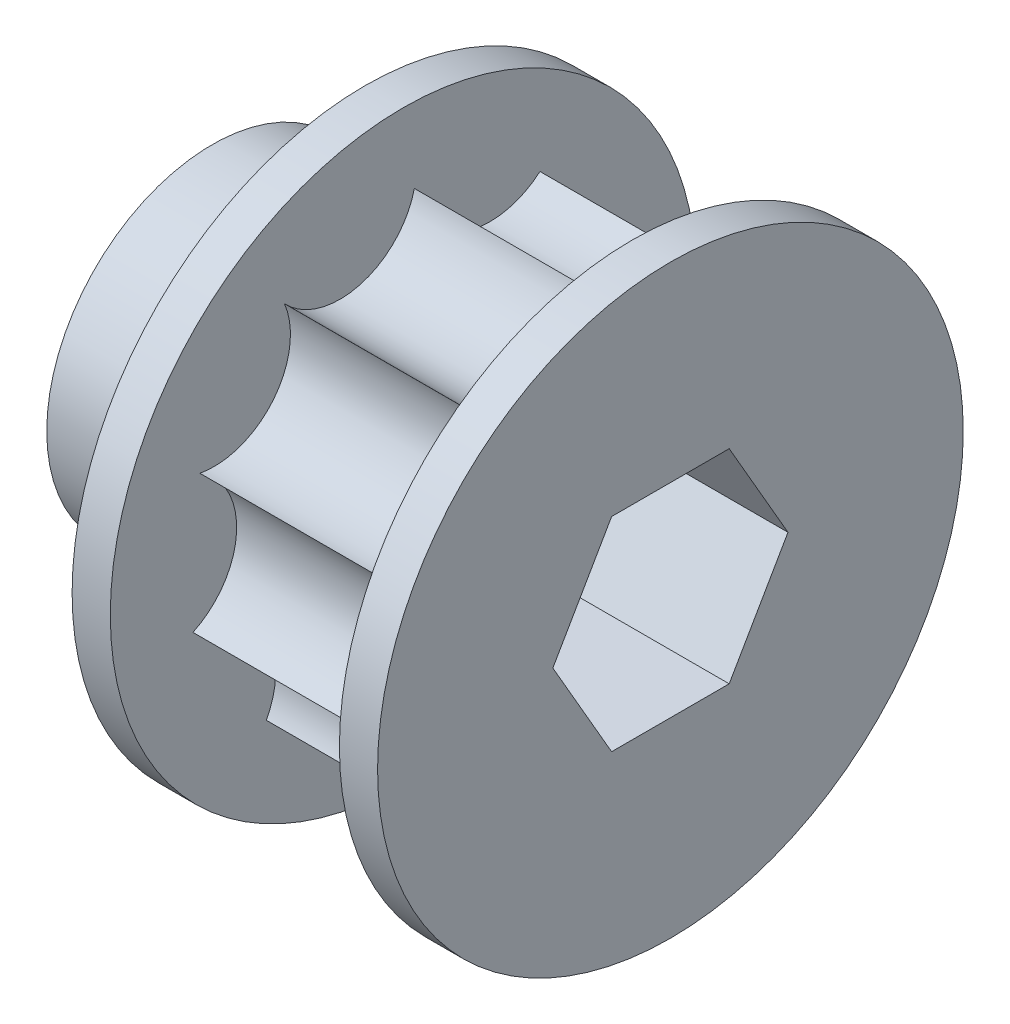
ISO-10303-21;
HEADER;
FILE_DESCRIPTION(('STEP AP214'),'2;1');
FILE_NAME('part.step','',(''),(''),'','','');
FILE_SCHEMA(('AUTOMOTIVE_DESIGN { 1 0 10303 214 1 1 1 1 }'));
ENDSEC;
DATA;
#1=APPLICATION_CONTEXT('core data for automotive mechanical design processes');
#2=APPLICATION_PROTOCOL_DEFINITION('international standard','automotive_design',2000,#1);
#3=PRODUCT_CONTEXT('',#1,'mechanical');
#4=PRODUCT('Part','Part','',(#3));
#5=PRODUCT_RELATED_PRODUCT_CATEGORY('part','',(#4));
#6=PRODUCT_DEFINITION_FORMATION('','',#4);
#7=PRODUCT_DEFINITION_CONTEXT('part definition',#1,'design');
#8=PRODUCT_DEFINITION('design','',#6,#7);
#9=PRODUCT_DEFINITION_SHAPE('','',#8);
#10=(LENGTH_UNIT() NAMED_UNIT(*) SI_UNIT(.MILLI.,.METRE.));
#11=(NAMED_UNIT(*) PLANE_ANGLE_UNIT() SI_UNIT($,.RADIAN.));
#12=(NAMED_UNIT(*) SI_UNIT($,.STERADIAN.) SOLID_ANGLE_UNIT());
#13=UNCERTAINTY_MEASURE_WITH_UNIT(LENGTH_MEASURE(1.E-05),#10,'distance_accuracy_value','');
#14=(GEOMETRIC_REPRESENTATION_CONTEXT(3) GLOBAL_UNCERTAINTY_ASSIGNED_CONTEXT((#13)) GLOBAL_UNIT_ASSIGNED_CONTEXT((#10,
#11,#12)) REPRESENTATION_CONTEXT('',''));
#15=CARTESIAN_POINT('',(0.,0.,0.));
#16=DIRECTION('',(0.,0.,1.));
#17=DIRECTION('',(1.,0.,0.));
#18=AXIS2_PLACEMENT_3D('',#15,#16,#17);
#19=CARTESIAN_POINT('',(11.90625,8.26700826155626,-12.7120967917712));
#20=DIRECTION('',(1.,0.,0.));
#21=DIRECTION('',(0.,0.,-1.));
#22=AXIS2_PLACEMENT_3D('',#19,#20,#21);
#23=CYLINDRICAL_SURFACE('',#22,4.7625);
#24=CARTESIAN_POINT('',(26.19375,8.26700826155626,-12.7120967917712));
#25=DIRECTION('',(-1.,0.,0.));
#26=DIRECTION('',(0.,0.,1.));
#27=AXIS2_PLACEMENT_3D('',#24,#25,#26);
#28=CIRCLE('',#27,4.7625);
#29=CARTESIAN_POINT('',(26.19375,3.52083091546551,-13.1060597969569));
#30=VERTEX_POINT('',#29);
#31=CARTESIAN_POINT('',(26.19375,10.5519607092464,-8.5335326171061));
#32=VERTEX_POINT('',#31);
#33=EDGE_CURVE('E272',#30,#32,#28,.T.);
#34=ORIENTED_EDGE('',*,*,#33,.F.);
#35=DIRECTION('',(1.,0.,0.));
#36=VECTOR('',#35,1.);
#37=CARTESIAN_POINT('',(19.05,3.52083091546551,-13.1060597969569));
#38=LINE('',#37,#36);
#39=CARTESIAN_POINT('',(11.90625,3.52083091546551,-13.1060597969569));
#40=VERTEX_POINT('',#39);
#41=EDGE_CURVE('E12',#30,#40,#38,.F.);
#42=ORIENTED_EDGE('',*,*,#41,.T.);
#43=CARTESIAN_POINT('',(11.90625,8.26700826155626,-12.7120967917712));
#44=DIRECTION('',(-1.,0.,0.));
#45=DIRECTION('',(0.,0.,1.));
#46=AXIS2_PLACEMENT_3D('',#43,#44,#45);
#47=CIRCLE('',#46,4.7625);
#48=CARTESIAN_POINT('',(11.90625,10.5519607092464,-8.5335326171061));
#49=VERTEX_POINT('',#48);
#50=EDGE_CURVE('E275',#40,#49,#47,.T.);
#51=ORIENTED_EDGE('',*,*,#50,.T.);
#52=DIRECTION('',(1.,0.,0.));
#53=VECTOR('',#52,1.);
#54=CARTESIAN_POINT('',(19.05,10.5519607092464,-8.5335326171061));
#55=LINE('',#54,#53);
#56=EDGE_CURVE('E42',#49,#32,#55,.T.);
#57=ORIENTED_EDGE('',*,*,#56,.T.);
#58=EDGE_LOOP('',(#34,#42,#51,#57));
#59=FACE_BOUND('',#58,.T.);
#60=ADVANCED_FACE('F34',(#59),#23,.F.);
#61=CARTESIAN_POINT('',(28.575,0.,0.));
#62=DIRECTION('',(-1.,0.,0.));
#63=DIRECTION('',(0.,0.,1.));
#64=AXIS2_PLACEMENT_3D('',#61,#62,#63);
#65=CYLINDRICAL_SURFACE('',#64,18.2626);
#66=CARTESIAN_POINT('',(9.525,0.,0.));
#67=DIRECTION('',(1.,0.,0.));
#68=DIRECTION('',(0.,0.,-1.));
#69=AXIS2_PLACEMENT_3D('',#66,#67,#68);
#70=CIRCLE('',#69,18.2626);
#71=CARTESIAN_POINT('',(9.525,0.,18.2626));
#72=VERTEX_POINT('',#71);
#73=EDGE_CURVE('E285',#72,#72,#70,.T.);
#74=CARTESIAN_POINT('',(11.90625,0.,0.));
#75=DIRECTION('',(1.,0.,0.));
#76=DIRECTION('',(0.,0.,-1.));
#77=AXIS2_PLACEMENT_3D('',#74,#75,#76);
#78=CIRCLE('',#77,18.2626);
#79=CARTESIAN_POINT('',(11.90625,0.,18.2626));
#80=VERTEX_POINT('',#79);
#81=EDGE_CURVE('E288',#80,#80,#78,.T.);
#82=CARTESIAN_POINT('',(9.525,0.,18.2626));
#83=CARTESIAN_POINT('',(9.5498046875,0.,18.2626));
#84=CARTESIAN_POINT('',(9.574609375,0.,18.2626));
#85=CARTESIAN_POINT('',(9.62421875,0.,18.2626));
#86=CARTESIAN_POINT('',(9.6490234375,0.,18.2626));
#87=CARTESIAN_POINT('',(9.6986328125,0.,18.2626));
#88=CARTESIAN_POINT('',(9.7234375,0.,18.2626));
#89=CARTESIAN_POINT('',(9.773046875,0.,18.2626));
#90=CARTESIAN_POINT('',(9.7978515625,0.,18.2626));
#91=CARTESIAN_POINT('',(9.8474609375,0.,18.2626));
#92=CARTESIAN_POINT('',(9.872265625,0.,18.2626));
#93=CARTESIAN_POINT('',(9.921875,0.,18.2626));
#94=CARTESIAN_POINT('',(9.9466796875,0.,18.2626));
#95=CARTESIAN_POINT('',(9.9962890625,0.,18.2626));
#96=CARTESIAN_POINT('',(10.02109375,0.,18.2626));
#97=CARTESIAN_POINT('',(10.070703125,0.,18.2626));
#98=CARTESIAN_POINT('',(10.0955078125,0.,18.2626));
#99=CARTESIAN_POINT('',(10.1451171875,0.,18.2626));
#100=CARTESIAN_POINT('',(10.169921875,0.,18.2626));
#101=CARTESIAN_POINT('',(10.21953125,0.,18.2626));
#102=CARTESIAN_POINT('',(10.2443359375,0.,18.2626));
#103=CARTESIAN_POINT('',(10.2939453125,0.,18.2626));
#104=CARTESIAN_POINT('',(10.31875,0.,18.2626));
#105=CARTESIAN_POINT('',(10.368359375,0.,18.2626));
#106=CARTESIAN_POINT('',(10.3931640625,0.,18.2626));
#107=CARTESIAN_POINT('',(10.4427734375,0.,18.2626));
#108=CARTESIAN_POINT('',(10.467578125,0.,18.2626));
#109=CARTESIAN_POINT('',(10.5171875,0.,18.2626));
#110=CARTESIAN_POINT('',(10.5419921875,0.,18.2626));
#111=CARTESIAN_POINT('',(10.5916015625,0.,18.2626));
#112=CARTESIAN_POINT('',(10.61640625,0.,18.2626));
#113=CARTESIAN_POINT('',(10.666015625,0.,18.2626));
#114=CARTESIAN_POINT('',(10.6908203125,0.,18.2626));
#115=CARTESIAN_POINT('',(10.7404296875,0.,18.2626));
#116=CARTESIAN_POINT('',(10.765234375,0.,18.2626));
#117=CARTESIAN_POINT('',(10.81484375,0.,18.2626));
#118=CARTESIAN_POINT('',(10.8396484375,0.,18.2626));
#119=CARTESIAN_POINT('',(10.8892578125,0.,18.2626));
#120=CARTESIAN_POINT('',(10.9140625,0.,18.2626));
#121=CARTESIAN_POINT('',(10.963671875,0.,18.2626));
#122=CARTESIAN_POINT('',(10.9884765625,0.,18.2626));
#123=CARTESIAN_POINT('',(11.0380859375,0.,18.2626));
#124=CARTESIAN_POINT('',(11.062890625,0.,18.2626));
#125=CARTESIAN_POINT('',(11.1125,0.,18.2626));
#126=CARTESIAN_POINT('',(11.1373046875,0.,18.2626));
#127=CARTESIAN_POINT('',(11.1869140625,0.,18.2626));
#128=CARTESIAN_POINT('',(11.21171875,0.,18.2626));
#129=CARTESIAN_POINT('',(11.261328125,0.,18.2626));
#130=CARTESIAN_POINT('',(11.2861328125,0.,18.2626));
#131=CARTESIAN_POINT('',(11.3357421875,0.,18.2626));
#132=CARTESIAN_POINT('',(11.360546875,0.,18.2626));
#133=CARTESIAN_POINT('',(11.41015625,0.,18.2626));
#134=CARTESIAN_POINT('',(11.4349609375,0.,18.2626));
#135=CARTESIAN_POINT('',(11.4845703125,0.,18.2626));
#136=CARTESIAN_POINT('',(11.509375,0.,18.2626));
#137=CARTESIAN_POINT('',(11.558984375,0.,18.2626));
#138=CARTESIAN_POINT('',(11.5837890625,0.,18.2626));
#139=CARTESIAN_POINT('',(11.6333984375,0.,18.2626));
#140=CARTESIAN_POINT('',(11.658203125,0.,18.2626));
#141=CARTESIAN_POINT('',(11.7078125,0.,18.2626));
#142=CARTESIAN_POINT('',(11.7326171875,0.,18.2626));
#143=CARTESIAN_POINT('',(11.7822265625,0.,18.2626));
#144=CARTESIAN_POINT('',(11.80703125,0.,18.2626));
#145=CARTESIAN_POINT('',(11.856640625,0.,18.2626));
#146=CARTESIAN_POINT('',(11.8814453125,0.,18.2626));
#147=CARTESIAN_POINT('',(11.90625,0.,18.2626));
#148=B_SPLINE_CURVE_WITH_KNOTS('',3,(#82,#83,#84,#85,#86,#87,#88,#89,#90,#91,#92,#93,#94,#95,
#96,#97,#98,#99,#100,#101,#102,#103,#104,#105,#106,#107,#108,#109,#110,#111,#112,#113,#114,#115,
#116,#117,#118,#119,#120,#121,#122,#123,#124,#125,#126,#127,#128,#129,#130,#131,#132,#133,#134,
#135,#136,#137,#138,#139,#140,#141,#142,#143,#144,#145,#146,#147),.UNSPECIFIED.,.F.,.F.,(4,2,2,
2,2,2,2,2,2,2,2,2,2,2,2,2,2,2,2,2,2,2,2,2,2,2,2,2,2,2,2,2,4),(0.,0.0744140625,0.148828125,
0.2232421875,0.29765625,0.3720703125,0.446484375,0.5208984375,0.5953125,0.669726562499997,
0.744140624999997,0.818554687499997,0.892968749999997,0.967382812499997,1.041796875,
1.1162109375,1.190625,1.2650390625,1.339453125,1.4138671875,1.48828125,1.5626953125,1.637109375,
1.7115234375,1.78593749999999,1.86035156249999,1.93476562499999,2.00917968749999,
2.08359374999999,2.15800781249999,2.23242187499999,2.30683593749999,2.38124999999999),.UNSPECIFIED.);
#149=EDGE_CURVE('BSEAM345',#72,#80,#148,.T.);
#150=ORIENTED_EDGE('',*,*,#73,.T.);
#151=ORIENTED_EDGE('',*,*,#81,.F.);
#152=ORIENTED_EDGE('',*,*,#149,.T.);
#153=ORIENTED_EDGE('',*,*,#149,.F.);
#154=EDGE_LOOP('',(#150,#152,#151,#153));
#155=FACE_BOUND('',#154,.T.);
#156=ADVANCED_FACE('F345',(#155),#65,.T.);
#157=CARTESIAN_POINT('',(9.525,0.,0.));
#158=DIRECTION('',(-1.,0.,0.));
#159=DIRECTION('',(0.,0.,1.));
#160=AXIS2_PLACEMENT_3D('',#157,#158,#159);
#161=CYLINDRICAL_SURFACE('',#160,10.31875);
#162=CARTESIAN_POINT('',(9.525,0.,0.));
#163=DIRECTION('',(1.,0.,0.));
#164=DIRECTION('',(0.,0.,-1.));
#165=AXIS2_PLACEMENT_3D('',#162,#163,#164);
#166=CIRCLE('',#165,10.31875);
#167=CARTESIAN_POINT('',(9.525,0.,10.31875));
#168=VERTEX_POINT('',#167);
#169=EDGE_CURVE('E289',#168,#168,#166,.T.);
#170=CARTESIAN_POINT('',(0.,0.,0.));
#171=DIRECTION('',(1.,0.,0.));
#172=DIRECTION('',(0.,0.,-1.));
#173=AXIS2_PLACEMENT_3D('',#170,#171,#172);
#174=CIRCLE('',#173,10.31875);
#175=CARTESIAN_POINT('',(0.,0.,10.31875));
#176=VERTEX_POINT('',#175);
#177=EDGE_CURVE('E284',#176,#176,#174,.T.);
#178=CARTESIAN_POINT('',(9.525,0.,10.31875));
#179=CARTESIAN_POINT('',(9.42578125,0.,10.31875));
#180=CARTESIAN_POINT('',(9.3265625,0.,10.31875));
#181=CARTESIAN_POINT('',(9.128125,0.,10.31875));
#182=CARTESIAN_POINT('',(9.02890625,0.,10.31875));
#183=CARTESIAN_POINT('',(8.83046875,0.,10.31875));
#184=CARTESIAN_POINT('',(8.73125,0.,10.31875));
#185=CARTESIAN_POINT('',(8.5328125,0.,10.31875));
#186=CARTESIAN_POINT('',(8.43359375,0.,10.31875));
#187=CARTESIAN_POINT('',(8.23515625,0.,10.31875));
#188=CARTESIAN_POINT('',(8.1359375,0.,10.31875));
#189=CARTESIAN_POINT('',(7.9375,0.,10.31875));
#190=CARTESIAN_POINT('',(7.83828125,0.,10.31875));
#191=CARTESIAN_POINT('',(7.63984375,0.,10.31875));
#192=CARTESIAN_POINT('',(7.540625,0.,10.31875));
#193=CARTESIAN_POINT('',(7.3421875,0.,10.31875));
#194=CARTESIAN_POINT('',(7.24296875,0.,10.31875));
#195=CARTESIAN_POINT('',(7.04453125,0.,10.31875));
#196=CARTESIAN_POINT('',(6.9453125,0.,10.31875));
#197=CARTESIAN_POINT('',(6.746875,0.,10.31875));
#198=CARTESIAN_POINT('',(6.64765625,0.,10.31875));
#199=CARTESIAN_POINT('',(6.44921875,0.,10.31875));
#200=CARTESIAN_POINT('',(6.35,0.,10.31875));
#201=CARTESIAN_POINT('',(6.1515625,0.,10.31875));
#202=CARTESIAN_POINT('',(6.05234375,0.,10.31875));
#203=CARTESIAN_POINT('',(5.85390625,0.,10.31875));
#204=CARTESIAN_POINT('',(5.7546875,0.,10.31875));
#205=CARTESIAN_POINT('',(5.55625,0.,10.31875));
#206=CARTESIAN_POINT('',(5.45703125,0.,10.31875));
#207=CARTESIAN_POINT('',(5.25859375,0.,10.31875));
#208=CARTESIAN_POINT('',(5.159375,0.,10.31875));
#209=CARTESIAN_POINT('',(4.9609375,0.,10.31875));
#210=CARTESIAN_POINT('',(4.86171875,0.,10.31875));
#211=CARTESIAN_POINT('',(4.66328125,0.,10.31875));
#212=CARTESIAN_POINT('',(4.5640625,0.,10.31875));
#213=CARTESIAN_POINT('',(4.365625,0.,10.31875));
#214=CARTESIAN_POINT('',(4.26640625,0.,10.31875));
#215=CARTESIAN_POINT('',(4.06796875,0.,10.31875));
#216=CARTESIAN_POINT('',(3.96875,0.,10.31875));
#217=CARTESIAN_POINT('',(3.7703125,0.,10.31875));
#218=CARTESIAN_POINT('',(3.67109375,0.,10.31875));
#219=CARTESIAN_POINT('',(3.47265625,0.,10.31875));
#220=CARTESIAN_POINT('',(3.3734375,0.,10.31875));
#221=CARTESIAN_POINT('',(3.175,0.,10.31875));
#222=CARTESIAN_POINT('',(3.07578125,0.,10.31875));
#223=CARTESIAN_POINT('',(2.87734375,0.,10.31875));
#224=CARTESIAN_POINT('',(2.778125,0.,10.31875));
#225=CARTESIAN_POINT('',(2.5796875,0.,10.31875));
#226=CARTESIAN_POINT('',(2.48046875,0.,10.31875));
#227=CARTESIAN_POINT('',(2.28203125,0.,10.31875));
#228=CARTESIAN_POINT('',(2.1828125,0.,10.31875));
#229=CARTESIAN_POINT('',(1.984375,0.,10.31875));
#230=CARTESIAN_POINT('',(1.88515625,0.,10.31875));
#231=CARTESIAN_POINT('',(1.68671875,0.,10.31875));
#232=CARTESIAN_POINT('',(1.5875,0.,10.31875));
#233=CARTESIAN_POINT('',(1.3890625,0.,10.31875));
#234=CARTESIAN_POINT('',(1.28984375,0.,10.31875));
#235=CARTESIAN_POINT('',(1.09140625,0.,10.31875));
#236=CARTESIAN_POINT('',(0.992187500000001,0.,10.31875));
#237=CARTESIAN_POINT('',(0.793750000000001,0.,10.31875));
#238=CARTESIAN_POINT('',(0.69453125,0.,10.31875));
#239=CARTESIAN_POINT('',(0.49609375,0.,10.31875));
#240=CARTESIAN_POINT('',(0.396875,0.,10.31875));
#241=CARTESIAN_POINT('',(0.1984375,0.,10.31875));
#242=CARTESIAN_POINT('',(0.0992187500000001,0.,10.31875));
#243=CARTESIAN_POINT('',(0.,0.,10.31875));
#244=B_SPLINE_CURVE_WITH_KNOTS('',3,(#178,#179,#180,#181,#182,#183,#184,#185,#186,#187,#188,
#189,#190,#191,#192,#193,#194,#195,#196,#197,#198,#199,#200,#201,#202,#203,#204,#205,#206,#207,
#208,#209,#210,#211,#212,#213,#214,#215,#216,#217,#218,#219,#220,#221,#222,#223,#224,#225,#226,
#227,#228,#229,#230,#231,#232,#233,#234,#235,#236,#237,#238,#239,#240,#241,#242,#243),
.UNSPECIFIED.,.F.,.F.,(4,2,2,2,2,2,2,2,2,2,2,2,2,2,2,2,2,2,2,2,2,2,2,2,2,2,2,2,2,2,2,2,4),(0.,
0.29765625,0.5953125,0.892968750000001,1.190625,1.48828125,1.7859375,2.08359375,2.38125,
2.67890625,2.9765625,3.27421875,3.571875,3.86953125,4.1671875,4.46484375,4.7625,5.06015625,
5.3578125,5.65546875,5.953125,6.25078125,6.5484375,6.84609375,7.14375,7.44140625,7.7390625,
8.03671875,8.334375,8.63203125,8.9296875,9.22734375,9.525),.UNSPECIFIED.);
#245=EDGE_CURVE('BSEAM36',#168,#176,#244,.T.);
#246=ORIENTED_EDGE('',*,*,#169,.F.);
#247=ORIENTED_EDGE('',*,*,#177,.T.);
#248=ORIENTED_EDGE('',*,*,#245,.T.);
#249=ORIENTED_EDGE('',*,*,#245,.F.);
#250=EDGE_LOOP('',(#246,#248,#247,#249));
#251=FACE_BOUND('',#250,.T.);
#252=ADVANCED_FACE('F36',(#251),#161,.T.);
#253=CARTESIAN_POINT('',(0.,0.,0.));
#254=DIRECTION('',(1.,0.,0.));
#255=DIRECTION('',(0.,0.,-1.));
#256=AXIS2_PLACEMENT_3D('',#253,#254,#255);
#257=PLANE('',#256);
#258=DIRECTION('',(0.,-0.866025403784439,0.5));
#259=VECTOR('',#258,1.);
#260=CARTESIAN_POINT('',(0.,0.,-7.33234841870825));
#261=LINE('',#260,#259);
#262=CARTESIAN_POINT('',(0.,0.,-7.33234841870825));
#263=VERTEX_POINT('',#262);
#264=CARTESIAN_POINT('',(0.,-6.35,-3.66617420935413));
#265=VERTEX_POINT('',#264);
#266=EDGE_CURVE('E180',#263,#265,#261,.T.);
#267=ORIENTED_EDGE('',*,*,#266,.F.);
#268=DIRECTION('',(0.,-0.866025403784439,-0.5));
#269=VECTOR('',#268,1.);
#270=CARTESIAN_POINT('',(0.,6.35,-3.66617420935413));
#271=LINE('',#270,#269);
#272=CARTESIAN_POINT('',(0.,6.35,-3.66617420935413));
#273=VERTEX_POINT('',#272);
#274=EDGE_CURVE('E49',#273,#263,#271,.T.);
#275=ORIENTED_EDGE('',*,*,#274,.F.);
#276=DIRECTION('',(0.,0.,-1.));
#277=VECTOR('',#276,1.);
#278=CARTESIAN_POINT('',(0.,6.35,3.66617420935412));
#279=LINE('',#278,#277);
#280=CARTESIAN_POINT('',(0.,6.35,3.66617420935412));
#281=VERTEX_POINT('',#280);
#282=EDGE_CURVE('E166',#281,#273,#279,.T.);
#283=ORIENTED_EDGE('',*,*,#282,.F.);
#284=DIRECTION('',(0.,0.866025403784439,-0.5));
#285=VECTOR('',#284,1.);
#286=CARTESIAN_POINT('',(0.,0.,7.33234841870825));
#287=LINE('',#286,#285);
#288=CARTESIAN_POINT('',(0.,0.,7.33234841870825));
#289=VERTEX_POINT('',#288);
#290=EDGE_CURVE('E169',#289,#281,#287,.T.);
#291=ORIENTED_EDGE('',*,*,#290,.F.);
#292=DIRECTION('',(0.,0.866025403784439,0.5));
#293=VECTOR('',#292,1.);
#294=CARTESIAN_POINT('',(0.,-6.35,3.66617420935413));
#295=LINE('',#294,#293);
#296=CARTESIAN_POINT('',(0.,-6.35,3.66617420935413));
#297=VERTEX_POINT('',#296);
#298=EDGE_CURVE('E185',#297,#289,#295,.T.);
#299=ORIENTED_EDGE('',*,*,#298,.F.);
#300=DIRECTION('',(0.,0.,1.));
#301=VECTOR('',#300,1.);
#302=CARTESIAN_POINT('',(0.,-6.35,-3.66617420935413));
#303=LINE('',#302,#301);
#304=EDGE_CURVE('E182',#265,#297,#303,.T.);
#305=ORIENTED_EDGE('',*,*,#304,.F.);
#306=EDGE_LOOP('',(#267,#275,#283,#291,#299,#305));
#307=FACE_BOUND('',#306,.T.);
#308=ORIENTED_EDGE('',*,*,#177,.F.);
#309=EDGE_LOOP('',(#308));
#310=FACE_BOUND('',#309,.T.);
#311=ADVANCED_FACE('F363',(#307,#310),#257,.F.);
#312=CARTESIAN_POINT('',(9.525,0.,0.));
#313=DIRECTION('',(1.,0.,0.));
#314=DIRECTION('',(0.,0.,-1.));
#315=AXIS2_PLACEMENT_3D('',#312,#313,#314);
#316=PLANE('',#315);
#317=ORIENTED_EDGE('',*,*,#73,.F.);
#318=EDGE_LOOP('',(#317));
#319=FACE_BOUND('',#318,.T.);
#320=ORIENTED_EDGE('',*,*,#169,.T.);
#321=EDGE_LOOP('',(#320));
#322=FACE_BOUND('',#321,.T.);
#323=ADVANCED_FACE('F357',(#319,#322),#316,.F.);
#324=CARTESIAN_POINT('',(11.90625,0.,0.));
#325=DIRECTION('',(1.,0.,0.));
#326=DIRECTION('',(0.,0.,-1.));
#327=AXIS2_PLACEMENT_3D('',#324,#325,#326);
#328=PLANE('',#327);
#329=ORIENTED_EDGE('',*,*,#50,.F.);
#330=CARTESIAN_POINT('',(11.90625,-0.783832843680508,-15.143527875405));
#331=DIRECTION('',(-1.,0.,0.));
#332=DIRECTION('',(0.,0.587785252292474,0.809016994374947));
#333=AXIS2_PLACEMENT_3D('',#330,#331,#332);
#334=CIRCLE('',#333,4.7625);
#335=CARTESIAN_POINT('',(11.90625,-4.85513661938228,-12.6725175929584));
#336=VERTEX_POINT('',#335);
#337=EDGE_CURVE('E270',#336,#40,#334,.T.);
#338=ORIENTED_EDGE('',*,*,#337,.F.);
#339=CARTESIAN_POINT('',(11.90625,-9.53527644412981,-11.7906460202155));
#340=DIRECTION('',(-1.,0.,0.));
#341=DIRECTION('',(0.,0.951056516295155,0.309016994374945));
#342=AXIS2_PLACEMENT_3D('',#339,#340,#341);
#343=CIRCLE('',#342,4.7625);
#344=CARTESIAN_POINT('',(11.90625,-11.3766069856503,-7.39850439148084));
#345=VERTEX_POINT('',#344);
#346=EDGE_CURVE('E261',#345,#336,#343,.T.);
#347=ORIENTED_EDGE('',*,*,#346,.F.);
#348=CARTESIAN_POINT('',(11.90625,-14.6445685350477,-3.93413813462233));
#349=DIRECTION('',(-1.,0.,0.));
#350=DIRECTION('',(0.,0.951056516295152,-0.309016994374952));
#351=AXIS2_PLACEMENT_3D('',#348,#349,#350);
#352=CIRCLE('',#351,4.7625);
#353=CARTESIAN_POINT('',(11.90625,-13.5526001600493,0.701486021627113));
#354=VERTEX_POINT('',#353);
#355=EDGE_CURVE('E252',#354,#345,#352,.T.);
#356=ORIENTED_EDGE('',*,*,#355,.F.);
#357=CARTESIAN_POINT('',(11.90625,-14.1601331961547,5.42507680195945));
#358=DIRECTION('',(-1.,0.,0.));
#359=DIRECTION('',(0.,0.587785252292469,-0.809016994374951));
#360=AXIS2_PLACEMENT_3D('',#357,#358,#359);
#361=CIRCLE('',#360,4.7625);
#362=CARTESIAN_POINT('',(11.90625,-10.5519607092466,8.53353261710624));
#363=VERTEX_POINT('',#362);
#364=EDGE_CURVE('E243',#363,#354,#361,.T.);
#365=ORIENTED_EDGE('',*,*,#364,.F.);
#366=CARTESIAN_POINT('',(11.90625,-8.26700826155626,12.7120967917712));
#367=DIRECTION('',(-1.,0.,0.));
#368=DIRECTION('',(0.,0.,-1.));
#369=AXIS2_PLACEMENT_3D('',#366,#367,#368);
#370=CIRCLE('',#369,4.7625);
#371=CARTESIAN_POINT('',(11.90625,-3.52083091546553,13.1060597969572));
#372=VERTEX_POINT('',#371);
#373=EDGE_CURVE('E234',#372,#363,#370,.T.);
#374=ORIENTED_EDGE('',*,*,#373,.F.);
#375=CARTESIAN_POINT('',(11.90625,0.78383284368062,15.143527875405));
#376=DIRECTION('',(-1.,0.,0.));
#377=DIRECTION('',(0.,-0.58778525229248,-0.809016994374942));
#378=AXIS2_PLACEMENT_3D('',#375,#376,#377);
#379=CIRCLE('',#378,4.7625);
#380=CARTESIAN_POINT('',(11.90625,4.85513661938235,12.6725175929584));
#381=VERTEX_POINT('',#380);
#382=EDGE_CURVE('E225',#381,#372,#379,.T.);
#383=ORIENTED_EDGE('',*,*,#382,.F.);
#384=CARTESIAN_POINT('',(11.90625,9.53527644412989,11.7906460202154));
#385=DIRECTION('',(-1.,0.,0.));
#386=DIRECTION('',(0.,-0.951056516295157,-0.309016994374938));
#387=AXIS2_PLACEMENT_3D('',#384,#385,#386);
#388=CIRCLE('',#387,4.7625);
#389=CARTESIAN_POINT('',(11.90625,11.3766069856503,7.39850439148076));
#390=VERTEX_POINT('',#389);
#391=EDGE_CURVE('E216',#390,#381,#388,.T.);
#392=ORIENTED_EDGE('',*,*,#391,.F.);
#393=CARTESIAN_POINT('',(11.90625,14.6445685350478,3.93413813462223));
#394=DIRECTION('',(-1.,0.,0.));
#395=DIRECTION('',(0.,-0.95105651629515,0.309016994374958));
#396=AXIS2_PLACEMENT_3D('',#393,#394,#395);
#397=CIRCLE('',#396,4.7625);
#398=CARTESIAN_POINT('',(11.90625,13.5526001600494,-0.701486021627213));
#399=VERTEX_POINT('',#398);
#400=EDGE_CURVE('E207',#399,#390,#397,.T.);
#401=ORIENTED_EDGE('',*,*,#400,.F.);
#402=CARTESIAN_POINT('',(11.90625,14.1601331961546,-5.42507680195955));
#403=DIRECTION('',(-1.,0.,0.));
#404=DIRECTION('',(0.,-0.587785252292462,0.809016994374955));
#405=AXIS2_PLACEMENT_3D('',#402,#403,#404);
#406=CIRCLE('',#405,4.7625);
#407=EDGE_CURVE('E200',#49,#399,#406,.T.);
#408=ORIENTED_EDGE('',*,*,#407,.F.);
#409=EDGE_LOOP('',(#329,#338,#347,#356,#365,#374,#383,#392,#401,#408));
#410=FACE_BOUND('',#409,.T.);
#411=ORIENTED_EDGE('',*,*,#81,.T.);
#412=EDGE_LOOP('',(#411));
#413=FACE_BOUND('',#412,.T.);
#414=ADVANCED_FACE('F314',(#410,#413),#328,.T.);
#415=CARTESIAN_POINT('',(26.19375,0.,0.));
#416=DIRECTION('',(1.,0.,0.));
#417=DIRECTION('',(0.,0.,-1.));
#418=AXIS2_PLACEMENT_3D('',#415,#416,#417);
#419=PLANE('',#418);
#420=CARTESIAN_POINT('',(26.19375,-0.783832843680508,-15.143527875405));
#421=DIRECTION('',(-1.,0.,0.));
#422=DIRECTION('',(0.,0.587785252292474,0.809016994374947));
#423=AXIS2_PLACEMENT_3D('',#420,#421,#422);
#424=CIRCLE('',#423,4.7625);
#425=CARTESIAN_POINT('',(26.19375,-4.85513661938228,-12.6725175929584));
#426=VERTEX_POINT('',#425);
#427=EDGE_CURVE('E269',#426,#30,#424,.T.);
#428=ORIENTED_EDGE('',*,*,#427,.T.);
#429=ORIENTED_EDGE('',*,*,#33,.T.);
#430=CARTESIAN_POINT('',(26.19375,14.1601331961546,-5.42507680195955));
#431=DIRECTION('',(-1.,0.,0.));
#432=DIRECTION('',(0.,-0.587785252292462,0.809016994374955));
#433=AXIS2_PLACEMENT_3D('',#430,#431,#432);
#434=CIRCLE('',#433,4.7625);
#435=CARTESIAN_POINT('',(26.19375,13.5526001600494,-0.701486021627213));
#436=VERTEX_POINT('',#435);
#437=EDGE_CURVE('E192',#32,#436,#434,.T.);
#438=ORIENTED_EDGE('',*,*,#437,.T.);
#439=CARTESIAN_POINT('',(26.19375,14.6445685350478,3.93413813462223));
#440=DIRECTION('',(-1.,0.,0.));
#441=DIRECTION('',(0.,-0.95105651629515,0.309016994374958));
#442=AXIS2_PLACEMENT_3D('',#439,#440,#441);
#443=CIRCLE('',#442,4.7625);
#444=CARTESIAN_POINT('',(26.19375,11.3766069856503,7.39850439148076));
#445=VERTEX_POINT('',#444);
#446=EDGE_CURVE('E206',#436,#445,#443,.T.);
#447=ORIENTED_EDGE('',*,*,#446,.T.);
#448=CARTESIAN_POINT('',(26.19375,9.53527644412989,11.7906460202154));
#449=DIRECTION('',(-1.,0.,0.));
#450=DIRECTION('',(0.,-0.951056516295157,-0.309016994374938));
#451=AXIS2_PLACEMENT_3D('',#448,#449,#450);
#452=CIRCLE('',#451,4.7625);
#453=CARTESIAN_POINT('',(26.19375,4.85513661938236,12.6725175929584));
#454=VERTEX_POINT('',#453);
#455=EDGE_CURVE('E215',#445,#454,#452,.T.);
#456=ORIENTED_EDGE('',*,*,#455,.T.);
#457=CARTESIAN_POINT('',(26.19375,0.78383284368062,15.143527875405));
#458=DIRECTION('',(-1.,0.,0.));
#459=DIRECTION('',(0.,-0.58778525229248,-0.809016994374942));
#460=AXIS2_PLACEMENT_3D('',#457,#458,#459);
#461=CIRCLE('',#460,4.7625);
#462=CARTESIAN_POINT('',(26.19375,-3.52083091546553,13.1060597969572));
#463=VERTEX_POINT('',#462);
#464=EDGE_CURVE('E224',#454,#463,#461,.T.);
#465=ORIENTED_EDGE('',*,*,#464,.T.);
#466=CARTESIAN_POINT('',(26.19375,-8.26700826155626,12.7120967917712));
#467=DIRECTION('',(-1.,0.,0.));
#468=DIRECTION('',(0.,0.,-1.));
#469=AXIS2_PLACEMENT_3D('',#466,#467,#468);
#470=CIRCLE('',#469,4.7625);
#471=CARTESIAN_POINT('',(26.19375,-10.5519607092466,8.53353261710624));
#472=VERTEX_POINT('',#471);
#473=EDGE_CURVE('E233',#463,#472,#470,.T.);
#474=ORIENTED_EDGE('',*,*,#473,.T.);
#475=CARTESIAN_POINT('',(26.19375,-14.1601331961547,5.42507680195945));
#476=DIRECTION('',(-1.,0.,0.));
#477=DIRECTION('',(0.,0.587785252292469,-0.809016994374951));
#478=AXIS2_PLACEMENT_3D('',#475,#476,#477);
#479=CIRCLE('',#478,4.7625);
#480=CARTESIAN_POINT('',(26.19375,-13.5526001600493,0.701486021627113));
#481=VERTEX_POINT('',#480);
#482=EDGE_CURVE('E242',#472,#481,#479,.T.);
#483=ORIENTED_EDGE('',*,*,#482,.T.);
#484=CARTESIAN_POINT('',(26.19375,-14.6445685350477,-3.93413813462233));
#485=DIRECTION('',(-1.,0.,0.));
#486=DIRECTION('',(0.,0.951056516295152,-0.309016994374952));
#487=AXIS2_PLACEMENT_3D('',#484,#485,#486);
#488=CIRCLE('',#487,4.7625);
#489=CARTESIAN_POINT('',(26.19375,-11.3766069856503,-7.39850439148084));
#490=VERTEX_POINT('',#489);
#491=EDGE_CURVE('E251',#481,#490,#488,.T.);
#492=ORIENTED_EDGE('',*,*,#491,.T.);
#493=CARTESIAN_POINT('',(26.19375,-9.53527644412981,-11.7906460202155));
#494=DIRECTION('',(-1.,0.,0.));
#495=DIRECTION('',(0.,0.951056516295155,0.309016994374945));
#496=AXIS2_PLACEMENT_3D('',#493,#494,#495);
#497=CIRCLE('',#496,4.7625);
#498=EDGE_CURVE('E260',#490,#426,#497,.T.);
#499=ORIENTED_EDGE('',*,*,#498,.T.);
#500=EDGE_LOOP('',(#428,#429,#438,#447,#456,#465,#474,#483,#492,#499));
#501=FACE_BOUND('',#500,.T.);
#502=CARTESIAN_POINT('',(26.19375,0.,0.));
#503=DIRECTION('',(1.,0.,0.));
#504=DIRECTION('',(0.,0.,-1.));
#505=AXIS2_PLACEMENT_3D('',#502,#503,#504);
#506=CIRCLE('',#505,18.2626);
#507=CARTESIAN_POINT('',(26.19375,0.,18.2626));
#508=VERTEX_POINT('',#507);
#509=EDGE_CURVE('E278',#508,#508,#506,.T.);
#510=ORIENTED_EDGE('',*,*,#509,.F.);
#511=EDGE_LOOP('',(#510));
#512=FACE_BOUND('',#511,.T.);
#513=ADVANCED_FACE('F304',(#501,#512),#419,.F.);
#514=CARTESIAN_POINT('',(28.575,0.,0.));
#515=DIRECTION('',(1.,0.,0.));
#516=DIRECTION('',(0.,0.,-1.));
#517=AXIS2_PLACEMENT_3D('',#514,#515,#516);
#518=PLANE('',#517);
#519=DIRECTION('',(0.,-0.866025403784439,-0.5));
#520=VECTOR('',#519,1.);
#521=CARTESIAN_POINT('',(28.575,6.35,-3.66617420935413));
#522=LINE('',#521,#520);
#523=CARTESIAN_POINT('',(28.575,6.35,-3.66617420935413));
#524=VERTEX_POINT('',#523);
#525=CARTESIAN_POINT('',(28.575,0.,-7.33234841870825));
#526=VERTEX_POINT('',#525);
#527=EDGE_CURVE('E149',#524,#526,#522,.T.);
#528=ORIENTED_EDGE('',*,*,#527,.T.);
#529=DIRECTION('',(0.,-0.866025403784439,0.5));
#530=VECTOR('',#529,1.);
#531=CARTESIAN_POINT('',(28.575,0.,-7.33234841870825));
#532=LINE('',#531,#530);
#533=CARTESIAN_POINT('',(28.575,-6.35,-3.66617420935413));
#534=VERTEX_POINT('',#533);
#535=EDGE_CURVE('E158',#526,#534,#532,.T.);
#536=ORIENTED_EDGE('',*,*,#535,.T.);
#537=DIRECTION('',(0.,0.,1.));
#538=VECTOR('',#537,1.);
#539=CARTESIAN_POINT('',(28.575,-6.35,-3.66617420935413));
#540=LINE('',#539,#538);
#541=CARTESIAN_POINT('',(28.575,-6.35,3.66617420935413));
#542=VERTEX_POINT('',#541);
#543=EDGE_CURVE('E57',#534,#542,#540,.T.);
#544=ORIENTED_EDGE('',*,*,#543,.T.);
#545=DIRECTION('',(0.,0.866025403784439,0.5));
#546=VECTOR('',#545,1.);
#547=CARTESIAN_POINT('',(28.575,-6.35,3.66617420935413));
#548=LINE('',#547,#546);
#549=CARTESIAN_POINT('',(28.575,0.,7.33234841870825));
#550=VERTEX_POINT('',#549);
#551=EDGE_CURVE('E173',#542,#550,#548,.T.);
#552=ORIENTED_EDGE('',*,*,#551,.T.);
#553=DIRECTION('',(0.,0.866025403784439,-0.5));
#554=VECTOR('',#553,1.);
#555=CARTESIAN_POINT('',(28.575,0.,7.33234841870825));
#556=LINE('',#555,#554);
#557=CARTESIAN_POINT('',(28.575,6.35,3.66617420935412));
#558=VERTEX_POINT('',#557);
#559=EDGE_CURVE('E176',#550,#558,#556,.T.);
#560=ORIENTED_EDGE('',*,*,#559,.T.);
#561=DIRECTION('',(0.,0.,-1.));
#562=VECTOR('',#561,1.);
#563=CARTESIAN_POINT('',(28.575,6.35,3.66617420935412));
#564=LINE('',#563,#562);
#565=EDGE_CURVE('E155',#558,#524,#564,.T.);
#566=ORIENTED_EDGE('',*,*,#565,.T.);
#567=EDGE_LOOP('',(#528,#536,#544,#552,#560,#566));
#568=FACE_BOUND('',#567,.T.);
#569=CARTESIAN_POINT('',(28.575,0.,0.));
#570=DIRECTION('',(1.,0.,0.));
#571=DIRECTION('',(0.,0.,-1.));
#572=AXIS2_PLACEMENT_3D('',#569,#570,#571);
#573=CIRCLE('',#572,18.2626);
#574=CARTESIAN_POINT('',(28.575,0.,18.2626));
#575=VERTEX_POINT('',#574);
#576=EDGE_CURVE('E281',#575,#575,#573,.T.);
#577=ORIENTED_EDGE('',*,*,#576,.T.);
#578=EDGE_LOOP('',(#577));
#579=FACE_BOUND('',#578,.T.);
#580=ADVANCED_FACE('F162',(#568,#579),#518,.T.);
#581=CARTESIAN_POINT('',(26.19375,0.,18.2626));
#582=CARTESIAN_POINT('',(26.2185546875,0.,18.2626));
#583=CARTESIAN_POINT('',(26.243359375,0.,18.2626));
#584=CARTESIAN_POINT('',(26.29296875,0.,18.2626));
#585=CARTESIAN_POINT('',(26.3177734375,0.,18.2626));
#586=CARTESIAN_POINT('',(26.3673828125,0.,18.2626));
#587=CARTESIAN_POINT('',(26.3921875,0.,18.2626));
#588=CARTESIAN_POINT('',(26.441796875,0.,18.2626));
#589=CARTESIAN_POINT('',(26.4666015625,0.,18.2626));
#590=CARTESIAN_POINT('',(26.5162109375,0.,18.2626));
#591=CARTESIAN_POINT('',(26.541015625,0.,18.2626));
#592=CARTESIAN_POINT('',(26.590625,0.,18.2626));
#593=CARTESIAN_POINT('',(26.6154296875,0.,18.2626));
#594=CARTESIAN_POINT('',(26.6650390625,0.,18.2626));
#595=CARTESIAN_POINT('',(26.68984375,0.,18.2626));
#596=CARTESIAN_POINT('',(26.739453125,0.,18.2626));
#597=CARTESIAN_POINT('',(26.7642578125,0.,18.2626));
#598=CARTESIAN_POINT('',(26.8138671875,0.,18.2626));
#599=CARTESIAN_POINT('',(26.838671875,0.,18.2626));
#600=CARTESIAN_POINT('',(26.88828125,0.,18.2626));
#601=CARTESIAN_POINT('',(26.9130859375,0.,18.2626));
#602=CARTESIAN_POINT('',(26.9626953125,0.,18.2626));
#603=CARTESIAN_POINT('',(26.9875,0.,18.2626));
#604=CARTESIAN_POINT('',(27.037109375,0.,18.2626));
#605=CARTESIAN_POINT('',(27.0619140625,0.,18.2626));
#606=CARTESIAN_POINT('',(27.1115234375,0.,18.2626));
#607=CARTESIAN_POINT('',(27.136328125,0.,18.2626));
#608=CARTESIAN_POINT('',(27.1859375,0.,18.2626));
#609=CARTESIAN_POINT('',(27.2107421875,0.,18.2626));
#610=CARTESIAN_POINT('',(27.2603515625,0.,18.2626));
#611=CARTESIAN_POINT('',(27.28515625,0.,18.2626));
#612=CARTESIAN_POINT('',(27.334765625,0.,18.2626));
#613=CARTESIAN_POINT('',(27.3595703125,0.,18.2626));
#614=CARTESIAN_POINT('',(27.4091796875,0.,18.2626));
#615=CARTESIAN_POINT('',(27.433984375,0.,18.2626));
#616=CARTESIAN_POINT('',(27.48359375,0.,18.2626));
#617=CARTESIAN_POINT('',(27.5083984375,0.,18.2626));
#618=CARTESIAN_POINT('',(27.5580078125,0.,18.2626));
#619=CARTESIAN_POINT('',(27.5828125,0.,18.2626));
#620=CARTESIAN_POINT('',(27.632421875,0.,18.2626));
#621=CARTESIAN_POINT('',(27.6572265625,0.,18.2626));
#622=CARTESIAN_POINT('',(27.7068359375,0.,18.2626));
#623=CARTESIAN_POINT('',(27.731640625,0.,18.2626));
#624=CARTESIAN_POINT('',(27.78125,0.,18.2626));
#625=CARTESIAN_POINT('',(27.8060546875,0.,18.2626));
#626=CARTESIAN_POINT('',(27.8556640625,0.,18.2626));
#627=CARTESIAN_POINT('',(27.88046875,0.,18.2626));
#628=CARTESIAN_POINT('',(27.930078125,0.,18.2626));
#629=CARTESIAN_POINT('',(27.9548828125,0.,18.2626));
#630=CARTESIAN_POINT('',(28.0044921875,0.,18.2626));
#631=CARTESIAN_POINT('',(28.029296875,0.,18.2626));
#632=CARTESIAN_POINT('',(28.07890625,0.,18.2626));
#633=CARTESIAN_POINT('',(28.1037109375,0.,18.2626));
#634=CARTESIAN_POINT('',(28.1533203125,0.,18.2626));
#635=CARTESIAN_POINT('',(28.178125,0.,18.2626));
#636=CARTESIAN_POINT('',(28.227734375,0.,18.2626));
#637=CARTESIAN_POINT('',(28.2525390625,0.,18.2626));
#638=CARTESIAN_POINT('',(28.3021484375,0.,18.2626));
#639=CARTESIAN_POINT('',(28.326953125,0.,18.2626));
#640=CARTESIAN_POINT('',(28.3765625,0.,18.2626));
#641=CARTESIAN_POINT('',(28.4013671875,0.,18.2626));
#642=CARTESIAN_POINT('',(28.4509765625,0.,18.2626));
#643=CARTESIAN_POINT('',(28.47578125,0.,18.2626));
#644=CARTESIAN_POINT('',(28.525390625,0.,18.2626));
#645=CARTESIAN_POINT('',(28.5501953125,0.,18.2626));
#646=CARTESIAN_POINT('',(28.575,0.,18.2626));
#647=B_SPLINE_CURVE_WITH_KNOTS('',3,(#581,#582,#583,#584,#585,#586,#587,#588,#589,#590,#591,
#592,#593,#594,#595,#596,#597,#598,#599,#600,#601,#602,#603,#604,#605,#606,#607,#608,#609,#610,
#611,#612,#613,#614,#615,#616,#617,#618,#619,#620,#621,#622,#623,#624,#625,#626,#627,#628,#629,
#630,#631,#632,#633,#634,#635,#636,#637,#638,#639,#640,#641,#642,#643,#644,#645,#646),
.UNSPECIFIED.,.F.,.F.,(4,2,2,2,2,2,2,2,2,2,2,2,2,2,2,2,2,2,2,2,2,2,2,2,2,2,2,2,2,2,2,2,4),(0.,
0.0744140625,0.148828125,0.2232421875,0.29765625,0.3720703125,0.446484375,0.5208984375,
0.5953125,0.6697265625,0.744140625,0.8185546875,0.892968750000001,0.967382812500001,1.041796875,
1.1162109375,1.190625,1.2650390625,1.339453125,1.4138671875,1.48828125,1.5626953125,1.637109375,
1.7115234375,1.7859375,1.8603515625,1.934765625,2.0091796875,2.08359375,2.1580078125,
2.232421875,2.3068359375,2.38125),.UNSPECIFIED.);
#648=EDGE_CURVE('BSEAM352',#508,#575,#647,.T.);
#649=ORIENTED_EDGE('',*,*,#509,.T.);
#650=ORIENTED_EDGE('',*,*,#576,.F.);
#651=ORIENTED_EDGE('',*,*,#648,.T.);
#652=ORIENTED_EDGE('',*,*,#648,.F.);
#653=EDGE_LOOP('',(#649,#651,#650,#652));
#654=FACE_BOUND('',#653,.T.);
#655=ADVANCED_FACE('F352',(#654),#65,.T.);
#656=CARTESIAN_POINT('',(11.90625,-0.783832843680508,-15.143527875405));
#657=DIRECTION('',(1.,0.,0.));
#658=DIRECTION('',(0.,0.,-1.));
#659=AXIS2_PLACEMENT_3D('',#656,#657,#658);
#660=CYLINDRICAL_SURFACE('',#659,4.7625);
#661=ORIENTED_EDGE('',*,*,#427,.F.);
#662=DIRECTION('',(1.,0.,0.));
#663=VECTOR('',#662,1.);
#664=CARTESIAN_POINT('',(19.05,-4.85513661938228,-12.6725175929584));
#665=LINE('',#664,#663);
#666=EDGE_CURVE('E264',#426,#336,#665,.F.);
#667=ORIENTED_EDGE('',*,*,#666,.T.);
#668=ORIENTED_EDGE('',*,*,#337,.T.);
#669=ORIENTED_EDGE('',*,*,#41,.F.);
#670=EDGE_LOOP('',(#661,#667,#668,#669));
#671=FACE_BOUND('',#670,.T.);
#672=ADVANCED_FACE('F309',(#671),#660,.F.);
#673=CARTESIAN_POINT('',(11.90625,-9.53527644412981,-11.7906460202155));
#674=DIRECTION('',(1.,0.,0.));
#675=DIRECTION('',(0.,0.,-1.));
#676=AXIS2_PLACEMENT_3D('',#673,#674,#675);
#677=CYLINDRICAL_SURFACE('',#676,4.7625);
#678=ORIENTED_EDGE('',*,*,#498,.F.);
#679=DIRECTION('',(1.,0.,0.));
#680=VECTOR('',#679,1.);
#681=CARTESIAN_POINT('',(19.05,-11.3766069856503,-7.39850439148084));
#682=LINE('',#681,#680);
#683=EDGE_CURVE('E255',#490,#345,#682,.F.);
#684=ORIENTED_EDGE('',*,*,#683,.T.);
#685=ORIENTED_EDGE('',*,*,#346,.T.);
#686=ORIENTED_EDGE('',*,*,#666,.F.);
#687=EDGE_LOOP('',(#678,#684,#685,#686));
#688=FACE_BOUND('',#687,.T.);
#689=ADVANCED_FACE('F311',(#688),#677,.F.);
#690=CARTESIAN_POINT('',(11.90625,-14.6445685350477,-3.93413813462233));
#691=DIRECTION('',(1.,0.,0.));
#692=DIRECTION('',(0.,0.,-1.));
#693=AXIS2_PLACEMENT_3D('',#690,#691,#692);
#694=CYLINDRICAL_SURFACE('',#693,4.7625);
#695=ORIENTED_EDGE('',*,*,#491,.F.);
#696=DIRECTION('',(1.,0.,0.));
#697=VECTOR('',#696,1.);
#698=CARTESIAN_POINT('',(19.05,-13.5526001600493,0.701486021627113));
#699=LINE('',#698,#697);
#700=EDGE_CURVE('E246',#481,#354,#699,.F.);
#701=ORIENTED_EDGE('',*,*,#700,.T.);
#702=ORIENTED_EDGE('',*,*,#355,.T.);
#703=ORIENTED_EDGE('',*,*,#683,.F.);
#704=EDGE_LOOP('',(#695,#701,#702,#703));
#705=FACE_BOUND('',#704,.T.);
#706=ADVANCED_FACE('F335',(#705),#694,.F.);
#707=CARTESIAN_POINT('',(11.90625,-14.1601331961547,5.42507680195945));
#708=DIRECTION('',(1.,0.,0.));
#709=DIRECTION('',(0.,0.,-1.));
#710=AXIS2_PLACEMENT_3D('',#707,#708,#709);
#711=CYLINDRICAL_SURFACE('',#710,4.7625);
#712=ORIENTED_EDGE('',*,*,#482,.F.);
#713=DIRECTION('',(1.,0.,0.));
#714=VECTOR('',#713,1.);
#715=CARTESIAN_POINT('',(19.05,-10.5519607092466,8.53353261710624));
#716=LINE('',#715,#714);
#717=EDGE_CURVE('E237',#472,#363,#716,.F.);
#718=ORIENTED_EDGE('',*,*,#717,.T.);
#719=ORIENTED_EDGE('',*,*,#364,.T.);
#720=ORIENTED_EDGE('',*,*,#700,.F.);
#721=EDGE_LOOP('',(#712,#718,#719,#720));
#722=FACE_BOUND('',#721,.T.);
#723=ADVANCED_FACE('F333',(#722),#711,.F.);
#724=CARTESIAN_POINT('',(11.90625,-8.26700826155626,12.7120967917712));
#725=DIRECTION('',(1.,0.,0.));
#726=DIRECTION('',(0.,0.,-1.));
#727=AXIS2_PLACEMENT_3D('',#724,#725,#726);
#728=CYLINDRICAL_SURFACE('',#727,4.7625);
#729=ORIENTED_EDGE('',*,*,#473,.F.);
#730=DIRECTION('',(1.,0.,0.));
#731=VECTOR('',#730,1.);
#732=CARTESIAN_POINT('',(19.05,-3.52083091546553,13.1060597969572));
#733=LINE('',#732,#731);
#734=EDGE_CURVE('E228',#463,#372,#733,.F.);
#735=ORIENTED_EDGE('',*,*,#734,.T.);
#736=ORIENTED_EDGE('',*,*,#373,.T.);
#737=ORIENTED_EDGE('',*,*,#717,.F.);
#738=EDGE_LOOP('',(#729,#735,#736,#737));
#739=FACE_BOUND('',#738,.T.);
#740=ADVANCED_FACE('F329',(#739),#728,.F.);
#741=CARTESIAN_POINT('',(11.90625,0.78383284368062,15.143527875405));
#742=DIRECTION('',(1.,0.,0.));
#743=DIRECTION('',(0.,0.,-1.));
#744=AXIS2_PLACEMENT_3D('',#741,#742,#743);
#745=CYLINDRICAL_SURFACE('',#744,4.7625);
#746=ORIENTED_EDGE('',*,*,#464,.F.);
#747=DIRECTION('',(1.,0.,0.));
#748=VECTOR('',#747,1.);
#749=CARTESIAN_POINT('',(19.05,4.85513661938236,12.6725175929584));
#750=LINE('',#749,#748);
#751=EDGE_CURVE('E219',#454,#381,#750,.F.);
#752=ORIENTED_EDGE('',*,*,#751,.T.);
#753=ORIENTED_EDGE('',*,*,#382,.T.);
#754=ORIENTED_EDGE('',*,*,#734,.F.);
#755=EDGE_LOOP('',(#746,#752,#753,#754));
#756=FACE_BOUND('',#755,.T.);
#757=ADVANCED_FACE('F326',(#756),#745,.F.);
#758=CARTESIAN_POINT('',(11.90625,9.53527644412989,11.7906460202154));
#759=DIRECTION('',(1.,0.,0.));
#760=DIRECTION('',(0.,0.,-1.));
#761=AXIS2_PLACEMENT_3D('',#758,#759,#760);
#762=CYLINDRICAL_SURFACE('',#761,4.7625);
#763=ORIENTED_EDGE('',*,*,#455,.F.);
#764=DIRECTION('',(1.,0.,0.));
#765=VECTOR('',#764,1.);
#766=CARTESIAN_POINT('',(19.05,11.3766069856503,7.39850439148076));
#767=LINE('',#766,#765);
#768=EDGE_CURVE('E210',#445,#390,#767,.F.);
#769=ORIENTED_EDGE('',*,*,#768,.T.);
#770=ORIENTED_EDGE('',*,*,#391,.T.);
#771=ORIENTED_EDGE('',*,*,#751,.F.);
#772=EDGE_LOOP('',(#763,#769,#770,#771));
#773=FACE_BOUND('',#772,.T.);
#774=ADVANCED_FACE('F324',(#773),#762,.F.);
#775=CARTESIAN_POINT('',(11.90625,14.6445685350478,3.93413813462223));
#776=DIRECTION('',(1.,0.,0.));
#777=DIRECTION('',(0.,0.,-1.));
#778=AXIS2_PLACEMENT_3D('',#775,#776,#777);
#779=CYLINDRICAL_SURFACE('',#778,4.7625);
#780=ORIENTED_EDGE('',*,*,#446,.F.);
#781=DIRECTION('',(1.,0.,0.));
#782=VECTOR('',#781,1.);
#783=CARTESIAN_POINT('',(19.05,13.5526001600494,-0.701486021627213));
#784=LINE('',#783,#782);
#785=EDGE_CURVE('E202',#436,#399,#784,.F.);
#786=ORIENTED_EDGE('',*,*,#785,.T.);
#787=ORIENTED_EDGE('',*,*,#400,.T.);
#788=ORIENTED_EDGE('',*,*,#768,.F.);
#789=EDGE_LOOP('',(#780,#786,#787,#788));
#790=FACE_BOUND('',#789,.T.);
#791=ADVANCED_FACE('F320',(#790),#779,.F.);
#792=CARTESIAN_POINT('',(11.90625,14.1601331961546,-5.42507680195955));
#793=DIRECTION('',(1.,0.,0.));
#794=DIRECTION('',(0.,0.,-1.));
#795=AXIS2_PLACEMENT_3D('',#792,#793,#794);
#796=CYLINDRICAL_SURFACE('',#795,4.7625);
#797=ORIENTED_EDGE('',*,*,#407,.T.);
#798=ORIENTED_EDGE('',*,*,#785,.F.);
#799=ORIENTED_EDGE('',*,*,#437,.F.);
#800=ORIENTED_EDGE('',*,*,#56,.F.);
#801=EDGE_LOOP('',(#797,#798,#799,#800));
#802=FACE_BOUND('',#801,.T.);
#803=ADVANCED_FACE('F318',(#802),#796,.F.);
#804=CARTESIAN_POINT('',(28.575,6.35,-3.66617420935413));
#805=DIRECTION('',(0.,0.5,-0.866025403784439));
#806=DIRECTION('',(0.,0.866025403784439,0.5));
#807=AXIS2_PLACEMENT_3D('',#804,#805,#806);
#808=PLANE('',#807);
#809=ORIENTED_EDGE('',*,*,#274,.T.);
#810=DIRECTION('',(-1.,0.,0.));
#811=VECTOR('',#810,1.);
#812=CARTESIAN_POINT('',(28.575,0.,-7.33234841870825));
#813=LINE('',#812,#811);
#814=EDGE_CURVE('E145',#526,#263,#813,.T.);
#815=ORIENTED_EDGE('',*,*,#814,.F.);
#816=ORIENTED_EDGE('',*,*,#527,.F.);
#817=DIRECTION('',(-1.,0.,0.));
#818=VECTOR('',#817,1.);
#819=CARTESIAN_POINT('',(28.575,6.35,-3.66617420935413));
#820=LINE('',#819,#818);
#821=EDGE_CURVE('E190',#524,#273,#820,.T.);
#822=ORIENTED_EDGE('',*,*,#821,.T.);
#823=EDGE_LOOP('',(#809,#815,#816,#822));
#824=FACE_BOUND('',#823,.T.);
#825=ADVANCED_FACE('F147',(#824),#808,.F.);
#826=CARTESIAN_POINT('',(28.575,6.35,3.66617420935412));
#827=DIRECTION('',(0.,1.,0.));
#828=DIRECTION('',(0.,0.,1.));
#829=AXIS2_PLACEMENT_3D('',#826,#827,#828);
#830=PLANE('',#829);
#831=ORIENTED_EDGE('',*,*,#282,.T.);
#832=ORIENTED_EDGE('',*,*,#821,.F.);
#833=ORIENTED_EDGE('',*,*,#565,.F.);
#834=DIRECTION('',(-1.,0.,0.));
#835=VECTOR('',#834,1.);
#836=CARTESIAN_POINT('',(28.575,6.35,3.66617420935412));
#837=LINE('',#836,#835);
#838=EDGE_CURVE('E193',#558,#281,#837,.T.);
#839=ORIENTED_EDGE('',*,*,#838,.T.);
#840=EDGE_LOOP('',(#831,#832,#833,#839));
#841=FACE_BOUND('',#840,.T.);
#842=ADVANCED_FACE('F388',(#841),#830,.F.);
#843=CARTESIAN_POINT('',(28.575,0.,7.33234841870825));
#844=DIRECTION('',(0.,0.5,0.866025403784438));
#845=DIRECTION('',(0.,-0.866025403784439,0.5));
#846=AXIS2_PLACEMENT_3D('',#843,#844,#845);
#847=PLANE('',#846);
#848=ORIENTED_EDGE('',*,*,#290,.T.);
#849=ORIENTED_EDGE('',*,*,#838,.F.);
#850=ORIENTED_EDGE('',*,*,#559,.F.);
#851=DIRECTION('',(-1.,0.,0.));
#852=VECTOR('',#851,1.);
#853=CARTESIAN_POINT('',(28.575,0.,7.33234841870825));
#854=LINE('',#853,#852);
#855=EDGE_CURVE('E195',#550,#289,#854,.T.);
#856=ORIENTED_EDGE('',*,*,#855,.T.);
#857=EDGE_LOOP('',(#848,#849,#850,#856));
#858=FACE_BOUND('',#857,.T.);
#859=ADVANCED_FACE('F386',(#858),#847,.F.);
#860=CARTESIAN_POINT('',(28.575,-6.35,3.66617420935413));
#861=DIRECTION('',(0.,-0.5,0.866025403784439));
#862=DIRECTION('',(0.,-0.866025403784439,-0.5));
#863=AXIS2_PLACEMENT_3D('',#860,#861,#862);
#864=PLANE('',#863);
#865=ORIENTED_EDGE('',*,*,#298,.T.);
#866=ORIENTED_EDGE('',*,*,#855,.F.);
#867=ORIENTED_EDGE('',*,*,#551,.F.);
#868=DIRECTION('',(-1.,0.,0.));
#869=VECTOR('',#868,1.);
#870=CARTESIAN_POINT('',(28.575,-6.35,3.66617420935413));
#871=LINE('',#870,#869);
#872=EDGE_CURVE('E197',#542,#297,#871,.T.);
#873=ORIENTED_EDGE('',*,*,#872,.T.);
#874=EDGE_LOOP('',(#865,#866,#867,#873));
#875=FACE_BOUND('',#874,.T.);
#876=ADVANCED_FACE('F383',(#875),#864,.F.);
#877=CARTESIAN_POINT('',(28.575,-6.35,-3.66617420935413));
#878=DIRECTION('',(0.,-1.,0.));
#879=DIRECTION('',(0.,0.,-1.));
#880=AXIS2_PLACEMENT_3D('',#877,#878,#879);
#881=PLANE('',#880);
#882=ORIENTED_EDGE('',*,*,#304,.T.);
#883=ORIENTED_EDGE('',*,*,#872,.F.);
#884=ORIENTED_EDGE('',*,*,#543,.F.);
#885=DIRECTION('',(-1.,0.,0.));
#886=VECTOR('',#885,1.);
#887=CARTESIAN_POINT('',(28.575,-6.35,-3.66617420935413));
#888=LINE('',#887,#886);
#889=EDGE_CURVE('E154',#534,#265,#888,.T.);
#890=ORIENTED_EDGE('',*,*,#889,.T.);
#891=EDGE_LOOP('',(#882,#883,#884,#890));
#892=FACE_BOUND('',#891,.T.);
#893=ADVANCED_FACE('F380',(#892),#881,.F.);
#894=CARTESIAN_POINT('',(28.575,0.,-7.33234841870825));
#895=DIRECTION('',(0.,-0.5,-0.866025403784439));
#896=DIRECTION('',(0.,0.866025403784439,-0.5));
#897=AXIS2_PLACEMENT_3D('',#894,#895,#896);
#898=PLANE('',#897);
#899=ORIENTED_EDGE('',*,*,#266,.T.);
#900=ORIENTED_EDGE('',*,*,#889,.F.);
#901=ORIENTED_EDGE('',*,*,#535,.F.);
#902=ORIENTED_EDGE('',*,*,#814,.T.);
#903=EDGE_LOOP('',(#899,#900,#901,#902));
#904=FACE_BOUND('',#903,.T.);
#905=ADVANCED_FACE('F159',(#904),#898,.F.);
#906=CLOSED_SHELL('',(#60,#156,#252,#311,#323,#414,#513,#580,#655,#672,#689,#706,#723,#740,#757,
#774,#791,#803,#825,#842,#859,#876,#893,#905));
#907=MANIFOLD_SOLID_BREP('B2',#906);
#908=ADVANCED_BREP_SHAPE_REPRESENTATION('',(#18,#907),#14);
#909=SHAPE_DEFINITION_REPRESENTATION(#9,#908);
ENDSEC;
END-ISO-10303-21;
